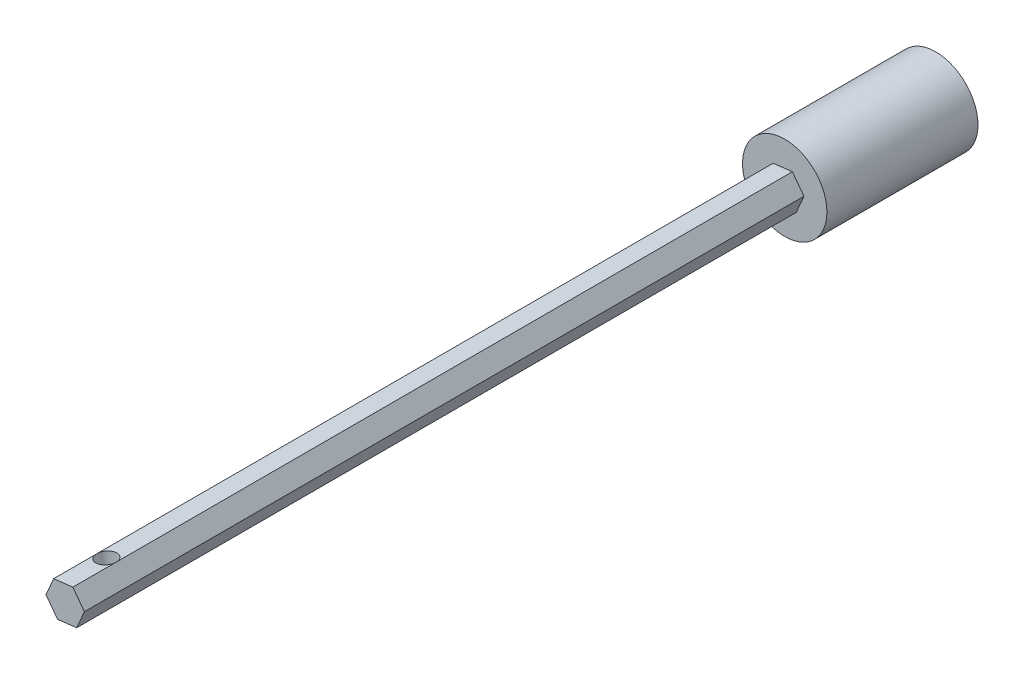
ISO-10303-21;
HEADER;
FILE_DESCRIPTION(('STEP AP214'),'2;1');
FILE_NAME('part.step','',(''),(''),'','','');
FILE_SCHEMA(('AUTOMOTIVE_DESIGN { 1 0 10303 214 1 1 1 1 }'));
ENDSEC;
DATA;
#1=APPLICATION_CONTEXT('core data for automotive mechanical design processes');
#2=APPLICATION_PROTOCOL_DEFINITION('international standard','automotive_design',2000,#1);
#3=PRODUCT_CONTEXT('',#1,'mechanical');
#4=PRODUCT('Part','Part','',(#3));
#5=PRODUCT_RELATED_PRODUCT_CATEGORY('part','',(#4));
#6=PRODUCT_DEFINITION_FORMATION('','',#4);
#7=PRODUCT_DEFINITION_CONTEXT('part definition',#1,'design');
#8=PRODUCT_DEFINITION('design','',#6,#7);
#9=PRODUCT_DEFINITION_SHAPE('','',#8);
#10=(LENGTH_UNIT() NAMED_UNIT(*) SI_UNIT(.MILLI.,.METRE.));
#11=(NAMED_UNIT(*) PLANE_ANGLE_UNIT() SI_UNIT($,.RADIAN.));
#12=(NAMED_UNIT(*) SI_UNIT($,.STERADIAN.) SOLID_ANGLE_UNIT());
#13=UNCERTAINTY_MEASURE_WITH_UNIT(LENGTH_MEASURE(1.E-05),#10,'distance_accuracy_value','');
#14=(GEOMETRIC_REPRESENTATION_CONTEXT(3) GLOBAL_UNCERTAINTY_ASSIGNED_CONTEXT((#13)) GLOBAL_UNIT_ASSIGNED_CONTEXT((#10,
#11,#12)) REPRESENTATION_CONTEXT('',''));
#15=CARTESIAN_POINT('',(0.,0.,0.));
#16=DIRECTION('',(0.,0.,1.));
#17=DIRECTION('',(1.,0.,0.));
#18=AXIS2_PLACEMENT_3D('',#15,#16,#17);
#19=CARTESIAN_POINT('',(5.80220423439102,13.4694026869797,660.4));
#20=DIRECTION('',(0.116585963589261,-0.993180604469279,0.));
#21=DIRECTION('',(0.993180604469279,0.116585963589261,0.));
#22=AXIS2_PLACEMENT_3D('',#19,#20,#21);
#23=PLANE('',#22);
#24=DIRECTION('',(0.,0.,-1.));
#25=VECTOR('',#24,1.);
#26=CARTESIAN_POINT('',(5.80220423439102,13.4694026869797,660.4));
#27=LINE('',#26,#25);
#28=CARTESIAN_POINT('',(5.80220423439102,13.4694026869797,627.66702));
#29=VERTEX_POINT('',#28);
#30=CARTESIAN_POINT('',(5.80220423439102,13.4694026869797,114.6048));
#31=VERTEX_POINT('',#30);
#32=EDGE_CURVE('E139',#29,#31,#27,.T.);
#33=ORIENTED_EDGE('',*,*,#32,.T.);
#34=DIRECTION('',(-0.993180604469279,-0.116585963589261,0.));
#35=VECTOR('',#34,1.);
#36=CARTESIAN_POINT('',(5.80220423439102,13.4694026869797,114.6048));
#37=LINE('',#36,#35);
#38=CARTESIAN_POINT('',(-8.76374278353125,11.7595576084181,114.6048));
#39=VERTEX_POINT('',#38);
#40=EDGE_CURVE('E148',#31,#39,#37,.T.);
#41=ORIENTED_EDGE('',*,*,#40,.T.);
#42=DIRECTION('',(0.,0.,-1.));
#43=VECTOR('',#42,1.);
#44=CARTESIAN_POINT('',(-8.76374278353125,11.7595576084181,660.4));
#45=LINE('',#44,#43);
#46=CARTESIAN_POINT('',(-8.76374278353125,11.7595576084181,627.66702));
#47=VERTEX_POINT('',#46);
#48=EDGE_CURVE('E136',#47,#39,#45,.T.);
#49=ORIENTED_EDGE('',*,*,#48,.F.);
#50=CARTESIAN_POINT('',(-1.48076927457011,12.6144801476989,627.66702));
#51=DIRECTION('',(-0.116585963589261,0.99318060446928,0.));
#52=DIRECTION('',(-0.99318060446928,-0.116585963589261,0.));
#53=AXIS2_PLACEMENT_3D('',#50,#51,#52);
#54=ELLIPSE('',#53,7.33298,7.2764254897878);
#55=EDGE_CURVE('E60',#29,#47,#54,.T.);
#56=ORIENTED_EDGE('',*,*,#55,.F.);
#57=EDGE_LOOP('',(#33,#41,#49,#56));
#58=FACE_BOUND('',#57,.T.);
#59=ADVANCED_FACE('F39',(#58),#23,.F.);
#60=CARTESIAN_POINT('',(-5.80220423439101,-13.4694026869797,660.4));
#61=DIRECTION('',(-0.116585963589262,0.993180604469279,0.));
#62=DIRECTION('',(-0.993180604469279,-0.116585963589262,0.));
#63=AXIS2_PLACEMENT_3D('',#60,#61,#62);
#64=PLANE('',#63);
#65=DIRECTION('',(0.,0.,-1.));
#66=VECTOR('',#65,1.);
#67=CARTESIAN_POINT('',(-5.80220423439101,-13.4694026869797,660.4));
#68=LINE('',#67,#66);
#69=CARTESIAN_POINT('',(-5.80220423439101,-13.4694026869797,660.4));
#70=VERTEX_POINT('',#69);
#71=CARTESIAN_POINT('',(-5.80220423439102,-13.4694026869797,627.66702));
#72=VERTEX_POINT('',#71);
#73=EDGE_CURVE('E130',#70,#72,#68,.T.);
#74=ORIENTED_EDGE('',*,*,#73,.T.);
#75=CARTESIAN_POINT('',(1.48076927457012,-12.6144801476989,627.66702));
#76=DIRECTION('',(-0.116585963589261,0.99318060446928,0.));
#77=DIRECTION('',(-0.99318060446928,-0.116585963589261,0.));
#78=AXIS2_PLACEMENT_3D('',#75,#76,#77);
#79=ELLIPSE('',#78,7.33298,7.2764254897878);
#80=CARTESIAN_POINT('',(8.76374278353125,-11.7595576084181,627.66702));
#81=VERTEX_POINT('',#80);
#82=EDGE_CURVE('E208',#72,#81,#79,.T.);
#83=ORIENTED_EDGE('',*,*,#82,.T.);
#84=DIRECTION('',(0.,0.,-1.));
#85=VECTOR('',#84,1.);
#86=CARTESIAN_POINT('',(8.76374278353125,-11.7595576084181,660.4));
#87=LINE('',#86,#85);
#88=CARTESIAN_POINT('',(8.76374278353125,-11.7595576084181,660.4));
#89=VERTEX_POINT('',#88);
#90=EDGE_CURVE('E123',#89,#81,#87,.T.);
#91=ORIENTED_EDGE('',*,*,#90,.F.);
#92=DIRECTION('',(0.993180604469279,0.116585963589262,0.));
#93=VECTOR('',#92,1.);
#94=CARTESIAN_POINT('',(-5.80220423439101,-13.4694026869797,660.4));
#95=LINE('',#94,#93);
#96=EDGE_CURVE('E209',#70,#89,#95,.T.);
#97=ORIENTED_EDGE('',*,*,#96,.F.);
#98=EDGE_LOOP('',(#74,#83,#91,#97));
#99=FACE_BOUND('',#98,.T.);
#100=ADVANCED_FACE('F183',(#99),#64,.F.);
#101=CARTESIAN_POINT('',(14.5659470179223,1.70984507856157,660.4));
#102=DIRECTION('',(-0.80182665222175,-0.597556708427628,0.));
#103=DIRECTION('',(0.597556708427628,-0.80182665222175,0.));
#104=AXIS2_PLACEMENT_3D('',#101,#102,#103);
#105=PLANE('',#104);
#106=DIRECTION('',(0.,0.,-1.));
#107=VECTOR('',#106,1.);
#108=CARTESIAN_POINT('',(14.5659470179223,1.70984507856157,660.4));
#109=LINE('',#108,#107);
#110=CARTESIAN_POINT('',(14.5659470179223,1.70984507856157,660.4));
#111=VERTEX_POINT('',#110);
#112=CARTESIAN_POINT('',(14.5659470179223,1.70984507856157,114.6048));
#113=VERTEX_POINT('',#112);
#114=EDGE_CURVE('E124',#111,#113,#109,.T.);
#115=ORIENTED_EDGE('',*,*,#114,.T.);
#116=DIRECTION('',(-0.597556708427628,0.80182665222175,0.));
#117=VECTOR('',#116,1.);
#118=CARTESIAN_POINT('',(14.5659470179223,1.70984507856157,114.6048));
#119=LINE('',#118,#117);
#120=EDGE_CURVE('E54',#113,#31,#119,.T.);
#121=ORIENTED_EDGE('',*,*,#120,.T.);
#122=ORIENTED_EDGE('',*,*,#32,.F.);
#123=CARTESIAN_POINT('',(5.80220423439102,13.4694026869797,660.4));
#124=VERTEX_POINT('',#123);
#125=EDGE_CURVE('E47',#124,#29,#27,.T.);
#126=ORIENTED_EDGE('',*,*,#125,.F.);
#127=DIRECTION('',(-0.597556708427628,0.80182665222175,0.));
#128=VECTOR('',#127,1.);
#129=CARTESIAN_POINT('',(14.5659470179223,1.70984507856157,660.4));
#130=LINE('',#129,#128);
#131=EDGE_CURVE('E303',#111,#124,#130,.T.);
#132=ORIENTED_EDGE('',*,*,#131,.F.);
#133=EDGE_LOOP('',(#115,#121,#122,#126,#132));
#134=FACE_BOUND('',#133,.T.);
#135=ADVANCED_FACE('F41',(#134),#105,.F.);
#136=ORIENTED_EDGE('',*,*,#125,.T.);
#137=EDGE_CURVE('E161',#47,#29,#54,.T.);
#138=ORIENTED_EDGE('',*,*,#137,.F.);
#139=CARTESIAN_POINT('',(-8.76374278353125,11.7595576084181,660.4));
#140=VERTEX_POINT('',#139);
#141=EDGE_CURVE('E137',#140,#47,#45,.T.);
#142=ORIENTED_EDGE('',*,*,#141,.F.);
#143=DIRECTION('',(-0.993180604469279,-0.116585963589261,0.));
#144=VECTOR('',#143,1.);
#145=CARTESIAN_POINT('',(5.80220423439102,13.4694026869797,660.4));
#146=LINE('',#145,#144);
#147=EDGE_CURVE('E300',#124,#140,#146,.T.);
#148=ORIENTED_EDGE('',*,*,#147,.F.);
#149=EDGE_LOOP('',(#136,#138,#142,#148));
#150=FACE_BOUND('',#149,.T.);
#151=ADVANCED_FACE('F189',(#150),#23,.F.);
#152=CARTESIAN_POINT('',(-8.76374278353125,11.7595576084181,660.4));
#153=DIRECTION('',(0.918412615811012,-0.395623896041651,0.));
#154=DIRECTION('',(0.395623896041651,0.918412615811012,0.));
#155=AXIS2_PLACEMENT_3D('',#152,#153,#154);
#156=PLANE('',#155);
#157=ORIENTED_EDGE('',*,*,#48,.T.);
#158=DIRECTION('',(-0.395623896041651,-0.918412615811012,0.));
#159=VECTOR('',#158,1.);
#160=CARTESIAN_POINT('',(-8.76374278353125,11.7595576084181,114.6048));
#161=LINE('',#160,#159);
#162=CARTESIAN_POINT('',(-14.5659470179223,-1.70984507856157,114.6048));
#163=VERTEX_POINT('',#162);
#164=EDGE_CURVE('E152',#39,#163,#161,.T.);
#165=ORIENTED_EDGE('',*,*,#164,.T.);
#166=DIRECTION('',(0.,0.,-1.));
#167=VECTOR('',#166,1.);
#168=CARTESIAN_POINT('',(-14.5659470179223,-1.70984507856157,660.4));
#169=LINE('',#168,#167);
#170=CARTESIAN_POINT('',(-14.5659470179223,-1.70984507856157,660.4));
#171=VERTEX_POINT('',#170);
#172=EDGE_CURVE('E133',#171,#163,#169,.T.);
#173=ORIENTED_EDGE('',*,*,#172,.F.);
#174=DIRECTION('',(-0.395623896041651,-0.918412615811012,0.));
#175=VECTOR('',#174,1.);
#176=CARTESIAN_POINT('',(-8.76374278353125,11.7595576084181,660.4));
#177=LINE('',#176,#175);
#178=EDGE_CURVE('E299',#140,#171,#177,.T.);
#179=ORIENTED_EDGE('',*,*,#178,.F.);
#180=ORIENTED_EDGE('',*,*,#141,.T.);
#181=EDGE_LOOP('',(#157,#165,#173,#179,#180));
#182=FACE_BOUND('',#181,.T.);
#183=ADVANCED_FACE('F186',(#182),#156,.F.);
#184=CARTESIAN_POINT('',(-14.5659470179223,-1.70984507856157,660.4));
#185=DIRECTION('',(0.80182665222175,0.597556708427628,0.));
#186=DIRECTION('',(-0.597556708427628,0.80182665222175,0.));
#187=AXIS2_PLACEMENT_3D('',#184,#185,#186);
#188=PLANE('',#187);
#189=ORIENTED_EDGE('',*,*,#172,.T.);
#190=DIRECTION('',(0.597556708427628,-0.80182665222175,0.));
#191=VECTOR('',#190,1.);
#192=CARTESIAN_POINT('',(-14.5659470179223,-1.70984507856157,114.6048));
#193=LINE('',#192,#191);
#194=CARTESIAN_POINT('',(-5.80220423439102,-13.4694026869797,114.6048));
#195=VERTEX_POINT('',#194);
#196=EDGE_CURVE('E117',#163,#195,#193,.T.);
#197=ORIENTED_EDGE('',*,*,#196,.T.);
#198=EDGE_CURVE('E116',#72,#195,#68,.T.);
#199=ORIENTED_EDGE('',*,*,#198,.F.);
#200=ORIENTED_EDGE('',*,*,#73,.F.);
#201=DIRECTION('',(0.597556708427628,-0.80182665222175,0.));
#202=VECTOR('',#201,1.);
#203=CARTESIAN_POINT('',(-14.5659470179223,-1.70984507856157,660.4));
#204=LINE('',#203,#202);
#205=EDGE_CURVE('E211',#171,#70,#204,.T.);
#206=ORIENTED_EDGE('',*,*,#205,.F.);
#207=EDGE_LOOP('',(#189,#197,#199,#200,#206));
#208=FACE_BOUND('',#207,.T.);
#209=ADVANCED_FACE('F182',(#208),#188,.F.);
#210=ORIENTED_EDGE('',*,*,#198,.T.);
#211=DIRECTION('',(0.993180604469279,0.116585963589262,0.));
#212=VECTOR('',#211,1.);
#213=CARTESIAN_POINT('',(-5.80220423439101,-13.4694026869797,114.6048));
#214=LINE('',#213,#212);
#215=CARTESIAN_POINT('',(8.76374278353125,-11.7595576084181,114.6048));
#216=VERTEX_POINT('',#215);
#217=EDGE_CURVE('E102',#195,#216,#214,.T.);
#218=ORIENTED_EDGE('',*,*,#217,.T.);
#219=EDGE_CURVE('E113',#81,#216,#87,.T.);
#220=ORIENTED_EDGE('',*,*,#219,.F.);
#221=EDGE_CURVE('E302',#81,#72,#79,.T.);
#222=ORIENTED_EDGE('',*,*,#221,.T.);
#223=EDGE_LOOP('',(#210,#218,#220,#222));
#224=FACE_BOUND('',#223,.T.);
#225=ADVANCED_FACE('F111',(#224),#64,.F.);
#226=CARTESIAN_POINT('',(8.76374278353125,-11.7595576084181,660.4));
#227=DIRECTION('',(-0.918412615811012,0.395623896041651,0.));
#228=DIRECTION('',(-0.395623896041651,-0.918412615811012,0.));
#229=AXIS2_PLACEMENT_3D('',#226,#227,#228);
#230=PLANE('',#229);
#231=ORIENTED_EDGE('',*,*,#219,.T.);
#232=DIRECTION('',(0.395623896041651,0.918412615811012,0.));
#233=VECTOR('',#232,1.);
#234=CARTESIAN_POINT('',(8.76374278353125,-11.7595576084181,114.6048));
#235=LINE('',#234,#233);
#236=EDGE_CURVE('E11',#216,#113,#235,.T.);
#237=ORIENTED_EDGE('',*,*,#236,.T.);
#238=ORIENTED_EDGE('',*,*,#114,.F.);
#239=DIRECTION('',(0.395623896041651,0.918412615811011,0.));
#240=VECTOR('',#239,1.);
#241=CARTESIAN_POINT('',(8.76374278353125,-11.7595576084181,660.4));
#242=LINE('',#241,#240);
#243=EDGE_CURVE('E126',#89,#111,#242,.T.);
#244=ORIENTED_EDGE('',*,*,#243,.F.);
#245=ORIENTED_EDGE('',*,*,#90,.T.);
#246=EDGE_LOOP('',(#231,#237,#238,#244,#245));
#247=FACE_BOUND('',#246,.T.);
#248=ADVANCED_FACE('F120',(#247),#230,.F.);
#249=CARTESIAN_POINT('',(0.,0.,660.4));
#250=DIRECTION('',(0.,0.,1.));
#251=DIRECTION('',(1.,0.,0.));
#252=AXIS2_PLACEMENT_3D('',#249,#250,#251);
#253=PLANE('',#252);
#254=ORIENTED_EDGE('',*,*,#131,.T.);
#255=ORIENTED_EDGE('',*,*,#147,.T.);
#256=ORIENTED_EDGE('',*,*,#178,.T.);
#257=ORIENTED_EDGE('',*,*,#205,.T.);
#258=ORIENTED_EDGE('',*,*,#96,.T.);
#259=ORIENTED_EDGE('',*,*,#243,.T.);
#260=EDGE_LOOP('',(#254,#255,#256,#257,#258,#259));
#261=FACE_BOUND('',#260,.T.);
#262=ADVANCED_FACE('F168',(#261),#253,.T.);
#263=CARTESIAN_POINT('',(2.36889924314728,-20.1803434118766,627.66702));
#264=DIRECTION('',(-0.116585963589261,0.99318060446928,0.));
#265=DIRECTION('',(-0.99318060446928,-0.116585963589261,0.));
#266=AXIS2_PLACEMENT_3D('',#263,#264,#265);
#267=ELLIPSE('',#266,7.33298,7.2764254897878);
#268=DIRECTION('',(-0.116585963589261,0.99318060446928,0.));
#269=VECTOR('',#268,1.);
#270=SURFACE_OF_LINEAR_EXTRUSION('',#267,#269);
#271=ORIENTED_EDGE('',*,*,#137,.T.);
#272=ORIENTED_EDGE('',*,*,#55,.T.);
#273=EDGE_LOOP('',(#271,#272));
#274=FACE_BOUND('',#273,.T.);
#275=ORIENTED_EDGE('',*,*,#221,.F.);
#276=ORIENTED_EDGE('',*,*,#82,.F.);
#277=EDGE_LOOP('',(#275,#276));
#278=FACE_BOUND('',#277,.T.);
#279=ADVANCED_FACE('F164',(#274,#278),#270,.F.);
#280=CARTESIAN_POINT('',(0.,0.,114.6048));
#281=DIRECTION('',(0.,0.,1.));
#282=DIRECTION('',(1.,0.,0.));
#283=AXIS2_PLACEMENT_3D('',#280,#281,#282);
#284=PLANE('',#283);
#285=CARTESIAN_POINT('',(0.,0.,114.6048));
#286=DIRECTION('',(0.,0.,1.));
#287=DIRECTION('',(1.,0.,0.));
#288=AXIS2_PLACEMENT_3D('',#285,#286,#287);
#289=CIRCLE('',#288,32.004);
#290=CARTESIAN_POINT('',(32.004,0.,114.6048));
#291=VERTEX_POINT('',#290);
#292=EDGE_CURVE('E118',#291,#291,#289,.T.);
#293=ORIENTED_EDGE('',*,*,#292,.T.);
#294=EDGE_LOOP('',(#293));
#295=FACE_BOUND('',#294,.T.);
#296=ORIENTED_EDGE('',*,*,#40,.F.);
#297=ORIENTED_EDGE('',*,*,#120,.F.);
#298=ORIENTED_EDGE('',*,*,#236,.F.);
#299=ORIENTED_EDGE('',*,*,#217,.F.);
#300=ORIENTED_EDGE('',*,*,#196,.F.);
#301=ORIENTED_EDGE('',*,*,#164,.F.);
#302=EDGE_LOOP('',(#296,#297,#298,#299,#300,#301));
#303=FACE_BOUND('',#302,.T.);
#304=ADVANCED_FACE('F101',(#295,#303),#284,.T.);
#305=CARTESIAN_POINT('',(0.,0.,114.6048));
#306=DIRECTION('',(0.,0.,-1.));
#307=DIRECTION('',(-1.,0.,0.));
#308=AXIS2_PLACEMENT_3D('',#305,#306,#307);
#309=CYLINDRICAL_SURFACE('',#308,32.004);
#310=ORIENTED_EDGE('',*,*,#292,.F.);
#311=EDGE_LOOP('',(#310));
#312=FACE_BOUND('',#311,.T.);
#313=CARTESIAN_POINT('',(0.,0.,0.));
#314=DIRECTION('',(0.,0.,1.));
#315=DIRECTION('',(1.,0.,0.));
#316=AXIS2_PLACEMENT_3D('',#313,#314,#315);
#317=CIRCLE('',#316,32.004);
#318=CARTESIAN_POINT('',(32.004,0.,0.));
#319=VERTEX_POINT('',#318);
#320=EDGE_CURVE('E214',#319,#319,#317,.T.);
#321=ORIENTED_EDGE('',*,*,#320,.T.);
#322=EDGE_LOOP('',(#321));
#323=FACE_BOUND('',#322,.T.);
#324=ADVANCED_FACE('F169',(#312,#323),#309,.T.);
#325=CARTESIAN_POINT('',(0.,0.,0.));
#326=DIRECTION('',(0.,0.,1.));
#327=DIRECTION('',(1.,0.,0.));
#328=AXIS2_PLACEMENT_3D('',#325,#326,#327);
#329=PLANE('',#328);
#330=ORIENTED_EDGE('',*,*,#320,.F.);
#331=EDGE_LOOP('',(#330));
#332=FACE_BOUND('',#331,.T.);
#333=ADVANCED_FACE('F174',(#332),#329,.F.);
#334=CLOSED_SHELL('',(#59,#100,#135,#151,#183,#209,#225,#248,#262,#279,#304,#324,#333));
#335=MANIFOLD_SOLID_BREP('B2',#334);
#336=ADVANCED_BREP_SHAPE_REPRESENTATION('',(#18,#335),#14);
#337=SHAPE_DEFINITION_REPRESENTATION(#9,#336);
ENDSEC;
END-ISO-10303-21;
